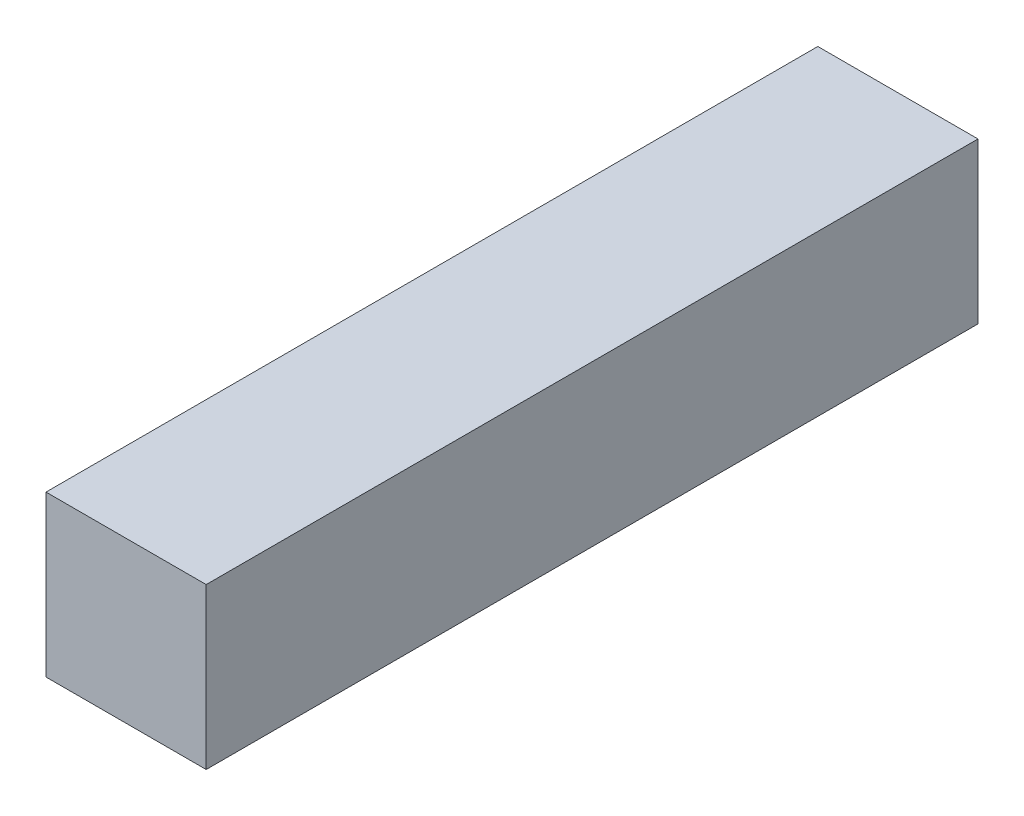
ISO-10303-21;
HEADER;
FILE_DESCRIPTION(('STEP AP214'),'2;1');
FILE_NAME('part.step','',(''),(''),'','','');
FILE_SCHEMA(('AUTOMOTIVE_DESIGN { 1 0 10303 214 1 1 1 1 }'));
ENDSEC;
DATA;
#1=APPLICATION_CONTEXT('core data for automotive mechanical design processes');
#2=APPLICATION_PROTOCOL_DEFINITION('international standard','automotive_design',2000,#1);
#3=PRODUCT_CONTEXT('',#1,'mechanical');
#4=PRODUCT('Part','Part','',(#3));
#5=PRODUCT_RELATED_PRODUCT_CATEGORY('part','',(#4));
#6=PRODUCT_DEFINITION_FORMATION('','',#4);
#7=PRODUCT_DEFINITION_CONTEXT('part definition',#1,'design');
#8=PRODUCT_DEFINITION('design','',#6,#7);
#9=PRODUCT_DEFINITION_SHAPE('','',#8);
#10=(LENGTH_UNIT() NAMED_UNIT(*) SI_UNIT(.MILLI.,.METRE.));
#11=(NAMED_UNIT(*) PLANE_ANGLE_UNIT() SI_UNIT($,.RADIAN.));
#12=(NAMED_UNIT(*) SI_UNIT($,.STERADIAN.) SOLID_ANGLE_UNIT());
#13=UNCERTAINTY_MEASURE_WITH_UNIT(LENGTH_MEASURE(1.E-05),#10,'distance_accuracy_value','');
#14=(GEOMETRIC_REPRESENTATION_CONTEXT(3) GLOBAL_UNCERTAINTY_ASSIGNED_CONTEXT((#13)) GLOBAL_UNIT_ASSIGNED_CONTEXT((#10,
#11,#12)) REPRESENTATION_CONTEXT('',''));
#15=CARTESIAN_POINT('',(0.,0.,0.));
#16=DIRECTION('',(0.,0.,1.));
#17=DIRECTION('',(1.,0.,0.));
#18=AXIS2_PLACEMENT_3D('',#15,#16,#17);
#19=CARTESIAN_POINT('',(11.,11.,106.));
#20=DIRECTION('',(-1.,0.,0.));
#21=DIRECTION('',(0.,-1.,0.));
#22=AXIS2_PLACEMENT_3D('',#19,#20,#21);
#23=PLANE('',#22);
#24=DIRECTION('',(0.,1.,0.));
#25=VECTOR('',#24,1.);
#26=CARTESIAN_POINT('',(11.,11.,0.));
#27=LINE('',#26,#25);
#28=CARTESIAN_POINT('',(11.,-11.,0.));
#29=VERTEX_POINT('',#28);
#30=CARTESIAN_POINT('',(11.,11.,0.));
#31=VERTEX_POINT('',#30);
#32=EDGE_CURVE('E95',#29,#31,#27,.T.);
#33=ORIENTED_EDGE('',*,*,#32,.T.);
#34=DIRECTION('',(0.,0.,-1.));
#35=VECTOR('',#34,1.);
#36=CARTESIAN_POINT('',(11.,11.,106.));
#37=LINE('',#36,#35);
#38=CARTESIAN_POINT('',(11.,11.,106.));
#39=VERTEX_POINT('',#38);
#40=EDGE_CURVE('E11',#39,#31,#37,.T.);
#41=ORIENTED_EDGE('',*,*,#40,.F.);
#42=DIRECTION('',(0.,1.,0.));
#43=VECTOR('',#42,1.);
#44=CARTESIAN_POINT('',(11.,11.,106.));
#45=LINE('',#44,#43);
#46=CARTESIAN_POINT('',(11.,-11.,106.));
#47=VERTEX_POINT('',#46);
#48=EDGE_CURVE('E83',#47,#39,#45,.T.);
#49=ORIENTED_EDGE('',*,*,#48,.F.);
#50=DIRECTION('',(0.,0.,-1.));
#51=VECTOR('',#50,1.);
#52=CARTESIAN_POINT('',(11.,-11.,106.));
#53=LINE('',#52,#51);
#54=EDGE_CURVE('E91',#47,#29,#53,.T.);
#55=ORIENTED_EDGE('',*,*,#54,.T.);
#56=EDGE_LOOP('',(#33,#41,#49,#55));
#57=FACE_BOUND('',#56,.T.);
#58=ADVANCED_FACE('F32',(#57),#23,.F.);
#59=CARTESIAN_POINT('',(-11.,11.,106.));
#60=DIRECTION('',(0.,-1.,0.));
#61=DIRECTION('',(0.,0.,-1.));
#62=AXIS2_PLACEMENT_3D('',#59,#60,#61);
#63=PLANE('',#62);
#64=DIRECTION('',(-1.,0.,0.));
#65=VECTOR('',#64,1.);
#66=CARTESIAN_POINT('',(-11.,11.,0.));
#67=LINE('',#66,#65);
#68=CARTESIAN_POINT('',(-11.,11.,0.));
#69=VERTEX_POINT('',#68);
#70=EDGE_CURVE('E87',#31,#69,#67,.T.);
#71=ORIENTED_EDGE('',*,*,#70,.T.);
#72=DIRECTION('',(0.,0.,-1.));
#73=VECTOR('',#72,1.);
#74=CARTESIAN_POINT('',(-11.,11.,106.));
#75=LINE('',#74,#73);
#76=CARTESIAN_POINT('',(-11.,11.,106.));
#77=VERTEX_POINT('',#76);
#78=EDGE_CURVE('E40',#77,#69,#75,.T.);
#79=ORIENTED_EDGE('',*,*,#78,.F.);
#80=DIRECTION('',(-1.,0.,0.));
#81=VECTOR('',#80,1.);
#82=CARTESIAN_POINT('',(-11.,11.,106.));
#83=LINE('',#82,#81);
#84=EDGE_CURVE('E78',#39,#77,#83,.T.);
#85=ORIENTED_EDGE('',*,*,#84,.F.);
#86=ORIENTED_EDGE('',*,*,#40,.T.);
#87=EDGE_LOOP('',(#71,#79,#85,#86));
#88=FACE_BOUND('',#87,.T.);
#89=ADVANCED_FACE('F86',(#88),#63,.F.);
#90=CARTESIAN_POINT('',(-11.,11.,106.));
#91=DIRECTION('',(1.,0.,0.));
#92=DIRECTION('',(0.,1.,0.));
#93=AXIS2_PLACEMENT_3D('',#90,#91,#92);
#94=PLANE('',#93);
#95=DIRECTION('',(0.,-1.,0.));
#96=VECTOR('',#95,1.);
#97=CARTESIAN_POINT('',(-11.,11.,0.));
#98=LINE('',#97,#96);
#99=CARTESIAN_POINT('',(-11.,-11.,0.));
#100=VERTEX_POINT('',#99);
#101=EDGE_CURVE('E65',#69,#100,#98,.T.);
#102=ORIENTED_EDGE('',*,*,#101,.T.);
#103=DIRECTION('',(0.,0.,-1.));
#104=VECTOR('',#103,1.);
#105=CARTESIAN_POINT('',(-11.,-11.,106.));
#106=LINE('',#105,#104);
#107=CARTESIAN_POINT('',(-11.,-11.,106.));
#108=VERTEX_POINT('',#107);
#109=EDGE_CURVE('E88',#108,#100,#106,.T.);
#110=ORIENTED_EDGE('',*,*,#109,.F.);
#111=DIRECTION('',(0.,-1.,0.));
#112=VECTOR('',#111,1.);
#113=CARTESIAN_POINT('',(-11.,11.,106.));
#114=LINE('',#113,#112);
#115=EDGE_CURVE('E81',#77,#108,#114,.T.);
#116=ORIENTED_EDGE('',*,*,#115,.F.);
#117=ORIENTED_EDGE('',*,*,#78,.T.);
#118=EDGE_LOOP('',(#102,#110,#116,#117));
#119=FACE_BOUND('',#118,.T.);
#120=ADVANCED_FACE('F89',(#119),#94,.F.);
#121=CARTESIAN_POINT('',(-11.,-11.,106.));
#122=DIRECTION('',(0.,1.,0.));
#123=DIRECTION('',(0.,0.,1.));
#124=AXIS2_PLACEMENT_3D('',#121,#122,#123);
#125=PLANE('',#124);
#126=DIRECTION('',(1.,0.,0.));
#127=VECTOR('',#126,1.);
#128=CARTESIAN_POINT('',(-11.,-11.,0.));
#129=LINE('',#128,#127);
#130=EDGE_CURVE('E71',#100,#29,#129,.T.);
#131=ORIENTED_EDGE('',*,*,#130,.T.);
#132=ORIENTED_EDGE('',*,*,#54,.F.);
#133=DIRECTION('',(1.,0.,0.));
#134=VECTOR('',#133,1.);
#135=CARTESIAN_POINT('',(-11.,-11.,106.));
#136=LINE('',#135,#134);
#137=EDGE_CURVE('E48',#108,#47,#136,.T.);
#138=ORIENTED_EDGE('',*,*,#137,.F.);
#139=ORIENTED_EDGE('',*,*,#109,.T.);
#140=EDGE_LOOP('',(#131,#132,#138,#139));
#141=FACE_BOUND('',#140,.T.);
#142=ADVANCED_FACE('F102',(#141),#125,.F.);
#143=CARTESIAN_POINT('',(0.,0.,106.));
#144=DIRECTION('',(0.,0.,1.));
#145=DIRECTION('',(1.,0.,0.));
#146=AXIS2_PLACEMENT_3D('',#143,#144,#145);
#147=PLANE('',#146);
#148=ORIENTED_EDGE('',*,*,#48,.T.);
#149=ORIENTED_EDGE('',*,*,#84,.T.);
#150=ORIENTED_EDGE('',*,*,#115,.T.);
#151=ORIENTED_EDGE('',*,*,#137,.T.);
#152=EDGE_LOOP('',(#148,#149,#150,#151));
#153=FACE_BOUND('',#152,.T.);
#154=ADVANCED_FACE('F79',(#153),#147,.T.);
#155=CARTESIAN_POINT('',(0.,0.,0.));
#156=DIRECTION('',(0.,0.,1.));
#157=DIRECTION('',(1.,0.,0.));
#158=AXIS2_PLACEMENT_3D('',#155,#156,#157);
#159=PLANE('',#158);
#160=ORIENTED_EDGE('',*,*,#32,.F.);
#161=ORIENTED_EDGE('',*,*,#130,.F.);
#162=ORIENTED_EDGE('',*,*,#101,.F.);
#163=ORIENTED_EDGE('',*,*,#70,.F.);
#164=EDGE_LOOP('',(#160,#161,#162,#163));
#165=FACE_BOUND('',#164,.T.);
#166=ADVANCED_FACE('F105',(#165),#159,.F.);
#167=CLOSED_SHELL('',(#58,#89,#120,#142,#154,#166));
#168=MANIFOLD_SOLID_BREP('B2',#167);
#169=ADVANCED_BREP_SHAPE_REPRESENTATION('',(#18,#168),#14);
#170=SHAPE_DEFINITION_REPRESENTATION(#9,#169);
ENDSEC;
END-ISO-10303-21;
